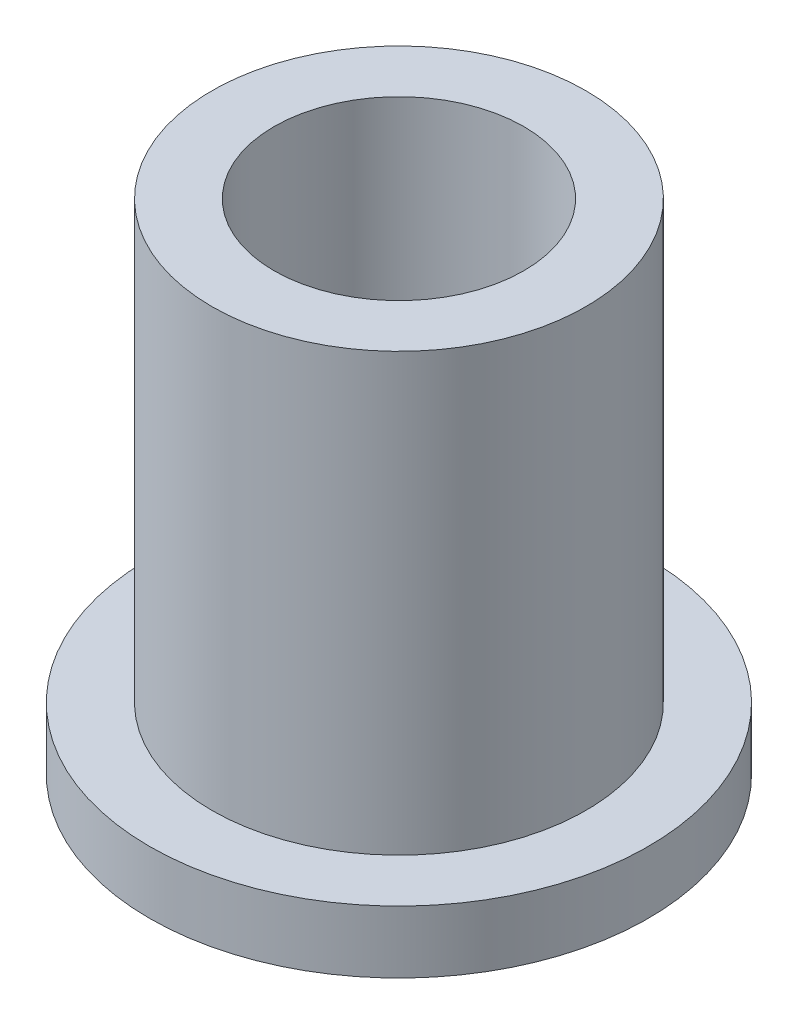
ISO-10303-21;
HEADER;
FILE_DESCRIPTION(('STEP AP214'),'2;1');
FILE_NAME('part.step','',(''),(''),'','','');
FILE_SCHEMA(('AUTOMOTIVE_DESIGN { 1 0 10303 214 1 1 1 1 }'));
ENDSEC;
DATA;
#1=APPLICATION_CONTEXT('core data for automotive mechanical design processes');
#2=APPLICATION_PROTOCOL_DEFINITION('international standard','automotive_design',2000,#1);
#3=PRODUCT_CONTEXT('',#1,'mechanical');
#4=PRODUCT('Part','Part','',(#3));
#5=PRODUCT_RELATED_PRODUCT_CATEGORY('part','',(#4));
#6=PRODUCT_DEFINITION_FORMATION('','',#4);
#7=PRODUCT_DEFINITION_CONTEXT('part definition',#1,'design');
#8=PRODUCT_DEFINITION('design','',#6,#7);
#9=PRODUCT_DEFINITION_SHAPE('','',#8);
#10=(LENGTH_UNIT() NAMED_UNIT(*) SI_UNIT(.MILLI.,.METRE.));
#11=(NAMED_UNIT(*) PLANE_ANGLE_UNIT() SI_UNIT($,.RADIAN.));
#12=(NAMED_UNIT(*) SI_UNIT($,.STERADIAN.) SOLID_ANGLE_UNIT());
#13=UNCERTAINTY_MEASURE_WITH_UNIT(LENGTH_MEASURE(1.E-05),#10,'distance_accuracy_value','');
#14=(GEOMETRIC_REPRESENTATION_CONTEXT(3) GLOBAL_UNCERTAINTY_ASSIGNED_CONTEXT((#13)) GLOBAL_UNIT_ASSIGNED_CONTEXT((#10,
#11,#12)) REPRESENTATION_CONTEXT('',''));
#15=CARTESIAN_POINT('',(0.,0.,0.));
#16=DIRECTION('',(0.,0.,1.));
#17=DIRECTION('',(1.,0.,0.));
#18=AXIS2_PLACEMENT_3D('',#15,#16,#17);
#19=CARTESIAN_POINT('',(0.,25.4,0.));
#20=DIRECTION('',(0.,1.,0.));
#21=DIRECTION('',(0.,0.,1.));
#22=AXIS2_PLACEMENT_3D('',#19,#20,#21);
#23=PLANE('',#22);
#24=CARTESIAN_POINT('',(0.,25.4,0.));
#25=DIRECTION('',(0.,1.,0.));
#26=DIRECTION('',(0.,0.,1.));
#27=AXIS2_PLACEMENT_3D('',#24,#25,#26);
#28=CIRCLE('',#27,9.525);
#29=CARTESIAN_POINT('',(0.,25.4,9.525));
#30=VERTEX_POINT('',#29);
#31=EDGE_CURVE('E10',#30,#30,#28,.T.);
#32=ORIENTED_EDGE('',*,*,#31,.T.);
#33=EDGE_LOOP('',(#32));
#34=FACE_BOUND('',#33,.T.);
#35=CARTESIAN_POINT('',(0.,25.4,0.));
#36=DIRECTION('',(0.,1.,0.));
#37=DIRECTION('',(0.,0.,1.));
#38=AXIS2_PLACEMENT_3D('',#35,#36,#37);
#39=CIRCLE('',#38,6.3627);
#40=CARTESIAN_POINT('',(0.,25.4,6.3627));
#41=VERTEX_POINT('',#40);
#42=EDGE_CURVE('E37',#41,#41,#39,.T.);
#43=ORIENTED_EDGE('',*,*,#42,.F.);
#44=EDGE_LOOP('',(#43));
#45=FACE_BOUND('',#44,.T.);
#46=ADVANCED_FACE('F30',(#34,#45),#23,.T.);
#47=CARTESIAN_POINT('',(0.,0.,0.));
#48=DIRECTION('',(0.,1.,0.));
#49=DIRECTION('',(0.,0.,1.));
#50=AXIS2_PLACEMENT_3D('',#47,#48,#49);
#51=PLANE('',#50);
#52=CARTESIAN_POINT('',(0.,0.,0.));
#53=DIRECTION('',(0.,1.,0.));
#54=DIRECTION('',(0.,0.,1.));
#55=AXIS2_PLACEMENT_3D('',#52,#53,#54);
#56=CIRCLE('',#55,6.3627);
#57=CARTESIAN_POINT('',(0.,0.,6.3627));
#58=VERTEX_POINT('',#57);
#59=EDGE_CURVE('E41',#58,#58,#56,.T.);
#60=ORIENTED_EDGE('',*,*,#59,.T.);
#61=EDGE_LOOP('',(#60));
#62=FACE_BOUND('',#61,.T.);
#63=CARTESIAN_POINT('',(0.,0.,0.));
#64=DIRECTION('',(0.,1.,0.));
#65=DIRECTION('',(0.,0.,1.));
#66=AXIS2_PLACEMENT_3D('',#63,#64,#65);
#67=CIRCLE('',#66,12.7);
#68=CARTESIAN_POINT('',(0.,0.,12.7));
#69=VERTEX_POINT('',#68);
#70=EDGE_CURVE('E48',#69,#69,#67,.T.);
#71=ORIENTED_EDGE('',*,*,#70,.F.);
#72=EDGE_LOOP('',(#71));
#73=FACE_BOUND('',#72,.T.);
#74=ADVANCED_FACE('F73',(#62,#73),#51,.F.);
#75=CARTESIAN_POINT('',(0.,25.4,0.));
#76=DIRECTION('',(0.,-1.,0.));
#77=DIRECTION('',(0.,0.,-1.));
#78=AXIS2_PLACEMENT_3D('',#75,#76,#77);
#79=CYLINDRICAL_SURFACE('',#78,9.525);
#80=CARTESIAN_POINT('',(0.,3.175,0.));
#81=DIRECTION('',(0.,1.,0.));
#82=DIRECTION('',(0.,0.,1.));
#83=AXIS2_PLACEMENT_3D('',#80,#81,#82);
#84=CIRCLE('',#83,9.525);
#85=CARTESIAN_POINT('',(0.,3.175,9.525));
#86=VERTEX_POINT('',#85);
#87=EDGE_CURVE('E51',#86,#86,#84,.T.);
#88=ORIENTED_EDGE('',*,*,#87,.T.);
#89=EDGE_LOOP('',(#88));
#90=FACE_BOUND('',#89,.T.);
#91=ORIENTED_EDGE('',*,*,#31,.F.);
#92=EDGE_LOOP('',(#91));
#93=FACE_BOUND('',#92,.T.);
#94=ADVANCED_FACE('F32',(#90,#93),#79,.T.);
#95=CARTESIAN_POINT('',(0.,25.4,0.));
#96=DIRECTION('',(0.,-1.,0.));
#97=DIRECTION('',(0.,0.,-1.));
#98=AXIS2_PLACEMENT_3D('',#95,#96,#97);
#99=CYLINDRICAL_SURFACE('',#98,6.3627);
#100=ORIENTED_EDGE('',*,*,#42,.T.);
#101=EDGE_LOOP('',(#100));
#102=FACE_BOUND('',#101,.T.);
#103=ORIENTED_EDGE('',*,*,#59,.F.);
#104=EDGE_LOOP('',(#103));
#105=FACE_BOUND('',#104,.T.);
#106=ADVANCED_FACE('F62',(#102,#105),#99,.F.);
#107=CARTESIAN_POINT('',(0.,3.175,0.));
#108=DIRECTION('',(0.,1.,0.));
#109=DIRECTION('',(0.,0.,1.));
#110=AXIS2_PLACEMENT_3D('',#107,#108,#109);
#111=PLANE('',#110);
#112=CARTESIAN_POINT('',(0.,3.175,0.));
#113=DIRECTION('',(0.,1.,0.));
#114=DIRECTION('',(0.,0.,1.));
#115=AXIS2_PLACEMENT_3D('',#112,#113,#114);
#116=CIRCLE('',#115,12.7);
#117=CARTESIAN_POINT('',(0.,3.175,12.7));
#118=VERTEX_POINT('',#117);
#119=EDGE_CURVE('E46',#118,#118,#116,.T.);
#120=ORIENTED_EDGE('',*,*,#119,.T.);
#121=EDGE_LOOP('',(#120));
#122=FACE_BOUND('',#121,.T.);
#123=ORIENTED_EDGE('',*,*,#87,.F.);
#124=EDGE_LOOP('',(#123));
#125=FACE_BOUND('',#124,.T.);
#126=ADVANCED_FACE('F59',(#122,#125),#111,.T.);
#127=CARTESIAN_POINT('',(0.,3.175,0.));
#128=DIRECTION('',(0.,-1.,0.));
#129=DIRECTION('',(0.,0.,-1.));
#130=AXIS2_PLACEMENT_3D('',#127,#128,#129);
#131=CYLINDRICAL_SURFACE('',#130,12.7);
#132=ORIENTED_EDGE('',*,*,#119,.F.);
#133=EDGE_LOOP('',(#132));
#134=FACE_BOUND('',#133,.T.);
#135=ORIENTED_EDGE('',*,*,#70,.T.);
#136=EDGE_LOOP('',(#135));
#137=FACE_BOUND('',#136,.T.);
#138=ADVANCED_FACE('F61',(#134,#137),#131,.T.);
#139=CLOSED_SHELL('',(#46,#74,#94,#106,#126,#138));
#140=MANIFOLD_SOLID_BREP('B2',#139);
#141=ADVANCED_BREP_SHAPE_REPRESENTATION('',(#18,#140),#14);
#142=SHAPE_DEFINITION_REPRESENTATION(#9,#141);
ENDSEC;
END-ISO-10303-21;
